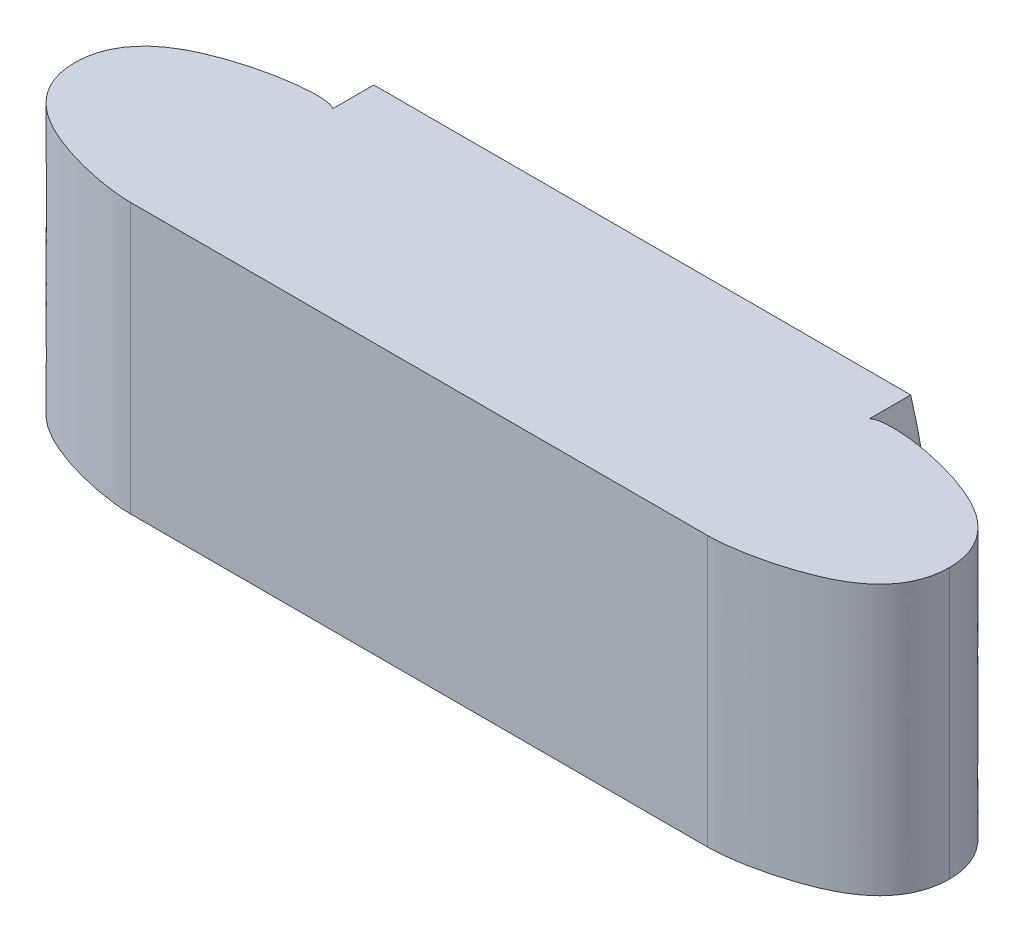
ISO-10303-21;
HEADER;
FILE_DESCRIPTION(('STEP AP214'),'2;1');
FILE_NAME('part.step','',(''),(''),'','','');
FILE_SCHEMA(('AUTOMOTIVE_DESIGN { 1 0 10303 214 1 1 1 1 }'));
ENDSEC;
DATA;
#1=APPLICATION_CONTEXT('core data for automotive mechanical design processes');
#2=APPLICATION_PROTOCOL_DEFINITION('international standard','automotive_design',2000,#1);
#3=PRODUCT_CONTEXT('',#1,'mechanical');
#4=PRODUCT('Part','Part','',(#3));
#5=PRODUCT_RELATED_PRODUCT_CATEGORY('part','',(#4));
#6=PRODUCT_DEFINITION_FORMATION('','',#4);
#7=PRODUCT_DEFINITION_CONTEXT('part definition',#1,'design');
#8=PRODUCT_DEFINITION('design','',#6,#7);
#9=PRODUCT_DEFINITION_SHAPE('','',#8);
#10=(LENGTH_UNIT() NAMED_UNIT(*) SI_UNIT(.MILLI.,.METRE.));
#11=(NAMED_UNIT(*) PLANE_ANGLE_UNIT() SI_UNIT($,.RADIAN.));
#12=(NAMED_UNIT(*) SI_UNIT($,.STERADIAN.) SOLID_ANGLE_UNIT());
#13=UNCERTAINTY_MEASURE_WITH_UNIT(LENGTH_MEASURE(1.E-05),#10,'distance_accuracy_value','');
#14=(GEOMETRIC_REPRESENTATION_CONTEXT(3) GLOBAL_UNCERTAINTY_ASSIGNED_CONTEXT((#13)) GLOBAL_UNIT_ASSIGNED_CONTEXT((#10,
#11,#12)) REPRESENTATION_CONTEXT('',''));
#15=CARTESIAN_POINT('',(0.,0.,0.));
#16=DIRECTION('',(0.,0.,1.));
#17=DIRECTION('',(1.,0.,0.));
#18=AXIS2_PLACEMENT_3D('',#15,#16,#17);
#19=CARTESIAN_POINT('',(0.,0.,1.));
#20=DIRECTION('',(0.,0.,-1.));
#21=DIRECTION('',(0.,-1.,0.));
#22=AXIS2_PLACEMENT_3D('',#19,#20,#21);
#23=PLANE('',#22);
#24=CARTESIAN_POINT('',(0.,0.,1.));
#25=DIRECTION('',(0.,0.,-1.));
#26=DIRECTION('',(0.,1.,0.));
#27=AXIS2_PLACEMENT_3D('',#24,#25,#26);
#28=CIRCLE('',#27,7.);
#29=CARTESIAN_POINT('',(0.,7.,1.));
#30=VERTEX_POINT('',#29);
#31=CARTESIAN_POINT('',(0.,-7.,1.));
#32=VERTEX_POINT('',#31);
#33=EDGE_CURVE('E11',#30,#32,#28,.T.);
#34=ORIENTED_EDGE('',*,*,#33,.T.);
#35=CARTESIAN_POINT('',(0.,0.,1.));
#36=DIRECTION('',(0.,0.,-1.));
#37=DIRECTION('',(0.,-1.,0.));
#38=AXIS2_PLACEMENT_3D('',#35,#36,#37);
#39=CIRCLE('',#38,7.);
#40=EDGE_CURVE('E209',#32,#30,#39,.T.);
#41=ORIENTED_EDGE('',*,*,#40,.T.);
#42=EDGE_LOOP('',(#34,#41));
#43=FACE_BOUND('',#42,.T.);
#44=ADVANCED_FACE('F17',(#43),#23,.T.);
#45=CARTESIAN_POINT('',(0.,0.,0.));
#46=DIRECTION('',(0.,0.,-1.));
#47=DIRECTION('',(0.,-1.,0.));
#48=AXIS2_PLACEMENT_3D('',#45,#46,#47);
#49=CYLINDRICAL_SURFACE('',#48,7.);
#50=DIRECTION('',(0.,0.,1.));
#51=VECTOR('',#50,1.);
#52=CARTESIAN_POINT('',(0.,-7.,0.));
#53=LINE('',#52,#51);
#54=CARTESIAN_POINT('',(0.,-7.,0.));
#55=VERTEX_POINT('',#54);
#56=EDGE_CURVE('E29',#55,#32,#53,.T.);
#57=ORIENTED_EDGE('',*,*,#56,.T.);
#58=ORIENTED_EDGE('',*,*,#33,.F.);
#59=DIRECTION('',(0.,0.,1.));
#60=VECTOR('',#59,1.);
#61=CARTESIAN_POINT('',(0.,7.,0.));
#62=LINE('',#61,#60);
#63=CARTESIAN_POINT('',(0.,7.,0.));
#64=VERTEX_POINT('',#63);
#65=EDGE_CURVE('E202',#64,#30,#62,.T.);
#66=ORIENTED_EDGE('',*,*,#65,.F.);
#67=CARTESIAN_POINT('',(0.,0.,0.));
#68=DIRECTION('',(0.,0.,-1.));
#69=DIRECTION('',(0.,1.,0.));
#70=AXIS2_PLACEMENT_3D('',#67,#68,#69);
#71=CIRCLE('',#70,7.);
#72=EDGE_CURVE('E225',#64,#55,#71,.T.);
#73=ORIENTED_EDGE('',*,*,#72,.T.);
#74=EDGE_LOOP('',(#57,#58,#66,#73));
#75=FACE_BOUND('',#74,.T.);
#76=ADVANCED_FACE('F316',(#75),#49,.F.);
#77=CARTESIAN_POINT('',(0.,0.,0.));
#78=DIRECTION('',(0.,0.,-1.));
#79=DIRECTION('',(0.,-1.,0.));
#80=AXIS2_PLACEMENT_3D('',#77,#78,#79);
#81=CYLINDRICAL_SURFACE('',#80,7.);
#82=ORIENTED_EDGE('',*,*,#65,.T.);
#83=ORIENTED_EDGE('',*,*,#40,.F.);
#84=ORIENTED_EDGE('',*,*,#56,.F.);
#85=CARTESIAN_POINT('',(0.,0.,0.));
#86=DIRECTION('',(0.,0.,-1.));
#87=DIRECTION('',(0.,-1.,0.));
#88=AXIS2_PLACEMENT_3D('',#85,#86,#87);
#89=CIRCLE('',#88,7.);
#90=EDGE_CURVE('E210',#55,#64,#89,.T.);
#91=ORIENTED_EDGE('',*,*,#90,.T.);
#92=EDGE_LOOP('',(#82,#83,#84,#91));
#93=FACE_BOUND('',#92,.T.);
#94=ADVANCED_FACE('F523',(#93),#81,.F.);
#95=CARTESIAN_POINT('',(47.,-14.5,0.));
#96=DIRECTION('',(0.,0.,-1.));
#97=DIRECTION('',(0.,-1.,0.));
#98=AXIS2_PLACEMENT_3D('',#95,#96,#97);
#99=PLANE('',#98);
#100=ORIENTED_EDGE('',*,*,#72,.F.);
#101=ORIENTED_EDGE('',*,*,#90,.F.);
#102=EDGE_LOOP('',(#100,#101));
#103=FACE_BOUND('',#102,.T.);
#104=DIRECTION('',(-1.,0.,0.));
#105=VECTOR('',#104,1.);
#106=CARTESIAN_POINT('',(28.85133226985,-14.5,0.));
#107=LINE('',#106,#105);
#108=CARTESIAN_POINT('',(28.85133226985,-14.5,0.));
#109=VERTEX_POINT('',#108);
#110=CARTESIAN_POINT('',(-28.85133226985,-14.5,0.));
#111=VERTEX_POINT('',#110);
#112=EDGE_CURVE('E139',#109,#111,#107,.T.);
#113=ORIENTED_EDGE('',*,*,#112,.T.);
#114=CARTESIAN_POINT('',(19.,0.,0.));
#115=DIRECTION('',(0.,0.,1.));
#116=DIRECTION('',(-0.957026645397087,0.289999999999996,0.));
#117=AXIS2_PLACEMENT_3D('',#114,#115,#116);
#118=CIRCLE('',#117,50.);
#119=CARTESIAN_POINT('',(-28.85133226985,14.5,0.));
#120=VERTEX_POINT('',#119);
#121=EDGE_CURVE('E219',#120,#111,#118,.T.);
#122=ORIENTED_EDGE('',*,*,#121,.F.);
#123=DIRECTION('',(-1.,0.,0.));
#124=VECTOR('',#123,1.);
#125=CARTESIAN_POINT('',(28.85133226985,14.5,0.));
#126=LINE('',#125,#124);
#127=CARTESIAN_POINT('',(28.85133226985,14.5,0.));
#128=VERTEX_POINT('',#127);
#129=EDGE_CURVE('E170',#128,#120,#126,.T.);
#130=ORIENTED_EDGE('',*,*,#129,.F.);
#131=CARTESIAN_POINT('',(-19.,0.,0.));
#132=DIRECTION('',(0.,0.,1.));
#133=DIRECTION('',(0.957026645397087,-0.289999999999996,0.));
#134=AXIS2_PLACEMENT_3D('',#131,#132,#133);
#135=CIRCLE('',#134,50.);
#136=EDGE_CURVE('E122',#109,#128,#135,.T.);
#137=ORIENTED_EDGE('',*,*,#136,.F.);
#138=EDGE_LOOP('',(#113,#122,#130,#137));
#139=FACE_BOUND('',#138,.T.);
#140=ADVANCED_FACE('F183',(#103,#139),#99,.T.);
#141=CARTESIAN_POINT('',(19.,0.,0.));
#142=DIRECTION('',(0.,0.,-1.));
#143=DIRECTION('',(0.,1.,0.));
#144=AXIS2_PLACEMENT_3D('',#141,#142,#143);
#145=CYLINDRICAL_SURFACE('',#144,50.);
#146=CARTESIAN_POINT('',(-28.8513322698526,14.5,4.42269033307216));
#147=CARTESIAN_POINT('',(-28.8685334892836,14.4432512843717,4.40855417445422));
#148=CARTESIAN_POINT('',(-28.8857298203386,14.3862390733473,4.39554570410287));
#149=CARTESIAN_POINT('',(-28.9216691597664,14.2663869319458,4.37019524061437));
#150=CARTESIAN_POINT('',(-28.9404044254138,14.2035063921404,4.35803301452686));
#151=CARTESIAN_POINT('',(-29.0012036666233,13.997897076426,4.32096496816654));
#152=CARTESIAN_POINT('',(-29.0428910514439,13.8544764082208,4.29933095131266));
#153=CARTESIAN_POINT('',(-29.1313728730695,13.5444032256657,4.25803922184989));
#154=CARTESIAN_POINT('',(-29.1779599739763,13.3775883700076,4.2392046909218));
#155=CARTESIAN_POINT('',(-29.2755674982137,13.0206511278056,4.20356238901548));
#156=CARTESIAN_POINT('',(-29.3263447867834,12.8304026723969,4.18736499573087));
#157=CARTESIAN_POINT('',(-29.4031434971355,12.5359757693923,4.16520367698253));
#158=CARTESIAN_POINT('',(-29.4299019662709,12.4320813197536,4.15793988033473));
#159=CARTESIAN_POINT('',(-29.4806784406313,12.2324722234143,4.14488466623565));
#160=CARTESIAN_POINT('',(-29.5047433132718,12.1367742074615,4.13902172867298));
#161=CARTESIAN_POINT('',(-29.5785565364245,11.8395948336228,4.12187188897468));
#162=CARTESIAN_POINT('',(-29.6273686443393,11.6378137736929,4.11173185226608));
#163=CARTESIAN_POINT('',(-29.725521164531,11.2204661696364,4.09308931718464));
#164=CARTESIAN_POINT('',(-29.7746910820035,11.0048531116903,4.08473539001696));
#165=CARTESIAN_POINT('',(-29.8730003705732,10.5598373327813,4.06948485625474));
#166=CARTESIAN_POINT('',(-29.9219575274125,10.3303903416587,4.06270715675907));
#167=CARTESIAN_POINT('',(-30.0193322047079,9.85770521739186,4.05043359882377));
#168=CARTESIAN_POINT('',(-30.0675602817692,9.61442569989027,4.04503269926015));
#169=CARTESIAN_POINT('',(-30.1673658022485,9.09127274352385,4.03490636143544));
#170=CARTESIAN_POINT('',(-30.2183896063582,8.81128940783681,4.03039772506137));
#171=CARTESIAN_POINT('',(-30.317289525825,8.24089466126707,4.02259963448827));
#172=CARTESIAN_POINT('',(-30.3649986528288,7.95045364094603,4.01935707105615));
#173=CARTESIAN_POINT('',(-30.456683381632,7.35914320806552,4.01384171701913));
#174=CARTESIAN_POINT('',(-30.5004835589762,7.05824628303726,4.01160450527875));
#175=CARTESIAN_POINT('',(-30.5838531120493,6.44602050510631,4.0078789302097));
#176=CARTESIAN_POINT('',(-30.6232415667313,6.13466680950786,4.00641690764801));
#177=CARTESIAN_POINT('',(-30.6783965631997,5.66347646332562,4.00465655834079));
#178=CARTESIAN_POINT('',(-30.6963063893175,5.50388849662287,4.00413859254919));
#179=CARTESIAN_POINT('',(-30.7336623654825,5.15648943274983,4.00315074159767));
#180=CARTESIAN_POINT('',(-30.7528252551032,4.96864789071186,4.00270530893085));
#181=CARTESIAN_POINT('',(-30.8071955585984,4.40452939345022,4.00157486199885));
#182=CARTESIAN_POINT('',(-30.8392512755186,4.02793873958225,4.00109667283236));
#183=CARTESIAN_POINT('',(-30.8750907614369,3.53786467822021,4.00067601411334));
#184=CARTESIAN_POINT('',(-30.8829617979773,3.42466872491621,4.00059281966735));
#185=CARTESIAN_POINT('',(-30.9107901824509,3.00389087760832,4.00032523277148));
#186=CARTESIAN_POINT('',(-30.9283041489891,2.69614383247203,4.00021223761968));
#187=CARTESIAN_POINT('',(-30.9640688891592,1.94730004448418,4.00003559898279));
#188=CARTESIAN_POINT('',(-30.9793661351159,1.5060596261032,4.00001439673422));
#189=CARTESIAN_POINT('',(-30.9981674629886,0.621723945996496,3.99999636293797));
#190=CARTESIAN_POINT('',(-31.00162847596,0.178627771972686,3.99999962025518));
#191=CARTESIAN_POINT('',(-30.9972035166171,-0.657834905050057,4.00000037829351));
#192=CARTESIAN_POINT('',(-30.9905459207424,-1.05120857713004,3.99999848333535));
#193=CARTESIAN_POINT('',(-30.9681351243441,-1.83275380614037,4.00003797283279));
#194=CARTESIAN_POINT('',(-30.9524972328387,-2.22092863644744,4.00007881391404));
#195=CARTESIAN_POINT('',(-30.912296731366,-2.99206799865676,4.00031482781505));
#196=CARTESIAN_POINT('',(-30.8878452974804,-3.37503833537559,4.00050811226007));
#197=CARTESIAN_POINT('',(-30.8303764580725,-4.13576889441879,4.00122472676346));
#198=CARTESIAN_POINT('',(-30.7974641120535,-4.51353702848767,4.00174411427821));
#199=CARTESIAN_POINT('',(-30.741881690069,-5.07790324891179,4.00295727100322));
#200=CARTESIAN_POINT('',(-30.7224180975414,-5.26482304090734,4.00343096580955));
#201=CARTESIAN_POINT('',(-30.6848977684737,-5.60691935801618,4.00446678224037));
#202=CARTESIAN_POINT('',(-30.6671577151499,-5.76213073436077,4.00500050062682));
#203=CARTESIAN_POINT('',(-30.61260294046,-6.22056339112905,4.00680438692722));
#204=CARTESIAN_POINT('',(-30.573754551061,-6.52354471894471,4.00829103718084));
#205=CARTESIAN_POINT('',(-30.4917194242113,-7.11953576041407,4.01204394555113));
#206=CARTESIAN_POINT('',(-30.4487003574996,-7.4125687555967,4.01428514490087));
#207=CARTESIAN_POINT('',(-30.3588038092634,-7.98866197621047,4.01977148105198));
#208=CARTESIAN_POINT('',(-30.3120887821078,-8.27174785362326,4.02298307918675));
#209=CARTESIAN_POINT('',(-30.2153642692413,-8.82794328786762,4.03066431287014));
#210=CARTESIAN_POINT('',(-30.1655094559711,-9.10108036451069,4.03509007371257));
#211=CARTESIAN_POINT('',(-30.0670205854302,-9.61713423094414,4.04509164863001));
#212=CARTESIAN_POINT('',(-30.0188326548399,-9.86013958808904,4.05049241622623));
#213=CARTESIAN_POINT('',(-29.9215446151803,-10.3322949705934,4.06276316894499));
#214=CARTESIAN_POINT('',(-29.8726334365858,-10.5614862853619,4.06953835082929));
#215=CARTESIAN_POINT('',(-29.7744210680594,-11.0060094756957,4.08478053158945));
#216=CARTESIAN_POINT('',(-29.7253015972809,-11.2213855108374,4.09312884650478));
#217=CARTESIAN_POINT('',(-29.6272527061696,-11.6382778001472,4.11175592876552));
#218=CARTESIAN_POINT('',(-29.5784933561758,-11.8398404581162,4.12188643923323));
#219=CARTESIAN_POINT('',(-29.5047609796736,-12.1366997780758,4.13901768511418));
#220=CARTESIAN_POINT('',(-29.4807224711625,-12.2322955658358,4.14487397614259));
#221=CARTESIAN_POINT('',(-29.4299701741199,-12.4318166510738,4.15792166051878));
#222=CARTESIAN_POINT('',(-29.4032088735188,-12.5357250924123,4.16518552280392));
#223=CARTESIAN_POINT('',(-29.3264018936421,-12.8301913039029,4.18734719030021));
#224=CARTESIAN_POINT('',(-29.2756189044651,-13.0204650140331,4.20354501639446));
#225=CARTESIAN_POINT('',(-29.1779999470289,-13.3774490513569,4.23918885930767));
#226=CARTESIAN_POINT('',(-29.1314072173212,-13.544285479515,4.25802439468686));
#227=CARTESIAN_POINT('',(-29.0429144954109,-13.8543981065911,4.29931895586374));
#228=CARTESIAN_POINT('',(-29.0012219191914,-13.9978366822976,4.32095464174467));
#229=CARTESIAN_POINT('',(-28.940415089945,-14.2034713541018,4.35802616088258));
#230=CARTESIAN_POINT('',(-28.9216775267362,-14.2663594640326,4.3701895642232));
#231=CARTESIAN_POINT('',(-28.8857338584984,-14.3862258170942,4.39554265630936));
#232=CARTESIAN_POINT('',(-28.8685354956447,-14.4432446779475,4.40855253579496));
#233=CARTESIAN_POINT('',(-28.8513322698526,-14.5,4.42269033307216));
#234=B_SPLINE_CURVE_WITH_KNOTS('',3,(#146,#147,#148,#149,#150,#151,#152,#153,#154,#155,#156,
#157,#158,#159,#160,#161,#162,#163,#164,#165,#166,#167,#168,#169,#170,#171,#172,#173,#174,#175,
#176,#177,#178,#179,#180,#181,#182,#183,#184,#185,#186,#187,#188,#189,#190,#191,#192,#193,#194,
#195,#196,#197,#198,#199,#200,#201,#202,#203,#204,#205,#206,#207,#208,#209,#210,#211,#212,#213,
#214,#215,#216,#217,#218,#219,#220,#221,#222,#223,#224,#225,#226,#227,#228,#229,#230,#231,#232,
#233),.UNSPECIFIED.,.F.,.F.,(4,2,2,2,2,2,2,2,2,2,2,2,2,2,2,2,2,2,2,2,2,2,2,2,2,2,2,2,2,2,2,2,2,
2,2,2,2,2,2,2,2,2,2,4),(0.,0.182843228150947,0.3830011565302,0.835581278887001,1.35815989354449,
1.95080828171586,2.27339608046583,2.56994618904999,3.19345658896128,3.8573451742631,
4.56144251521076,5.30562993673431,6.15947607017043,7.04247971972194,7.9546562088416,
8.89611099540449,9.37787655306657,9.94431944569695,11.0780515123653,11.4184583771191,
12.3431401470449,13.6674964771679,14.9966666942951,16.176853037296,17.3422139510085,
18.4933615973835,19.6308531398629,20.1946362383189,20.6632990758169,21.5796383140351,
22.4681368651641,23.3288877390836,24.1619012895102,24.9052586707058,25.6085773381916,
26.2717389802642,26.894574843882,27.1908076261088,27.5134381059666,28.1061639347782,
28.628809339952,29.081445497808,29.2816273966252,29.4644919020293),.UNSPECIFIED.);
#235=CARTESIAN_POINT('',(-28.85133226985,-14.5,4.422690333069));
#236=VERTEX_POINT('',#235);
#237=CARTESIAN_POINT('',(-28.85133226985,14.5,4.422690333069));
#238=VERTEX_POINT('',#237);
#239=EDGE_CURVE('E226',#236,#238,#234,.F.);
#240=ORIENTED_EDGE('',*,*,#239,.T.);
#241=DIRECTION('',(0.,0.,-1.));
#242=VECTOR('',#241,1.);
#243=CARTESIAN_POINT('',(-28.85133226985,14.5,4.422690333069));
#244=LINE('',#243,#242);
#245=EDGE_CURVE('E282',#238,#120,#244,.T.);
#246=ORIENTED_EDGE('',*,*,#245,.T.);
#247=ORIENTED_EDGE('',*,*,#121,.T.);
#248=DIRECTION('',(0.,0.,-1.));
#249=VECTOR('',#248,1.);
#250=CARTESIAN_POINT('',(-28.85133226985,-14.5,4.422690333069));
#251=LINE('',#250,#249);
#252=EDGE_CURVE('E147',#236,#111,#251,.T.);
#253=ORIENTED_EDGE('',*,*,#252,.F.);
#254=EDGE_LOOP('',(#240,#246,#247,#253));
#255=FACE_BOUND('',#254,.T.);
#256=ADVANCED_FACE('F297',(#255),#145,.T.);
#257=CARTESIAN_POINT('',(-46.99635920013,-17.4,14.24913241907));
#258=CARTESIAN_POINT('',(-46.99879390348,-17.4,14.16541556951));
#259=CARTESIAN_POINT('',(-47.02748718326,-17.4,12.18980767287));
#260=CARTESIAN_POINT('',(-45.51419571602,-17.4,8.495823372431));
#261=CARTESIAN_POINT('',(-39.31887974557,-17.4,5.12263144327));
#262=CARTESIAN_POINT('',(-31.51819213462,-17.4,3.68258193458));
#263=CARTESIAN_POINT('',(-29.07947994879,-17.4,4.157639473443));
#264=CARTESIAN_POINT('',(-28.77650916067,-17.4,4.493852182639));
#265=(BOUNDED_CURVE() B_SPLINE_CURVE(3,(#257,#258,#259,#260,#261,#262,#263,#264),.UNSPECIFIED.,
.F.,.F.) B_SPLINE_CURVE_WITH_KNOTS((4,1,1,1,1,4),(0.,0.008553627505914,0.2034925259936,
0.4709151678218,0.8244325212668,1.),
.UNSPECIFIED.) CURVE() GEOMETRIC_REPRESENTATION_ITEM() RATIONAL_B_SPLINE_CURVE((1.,1.,1.,1.,1.,
1.,1.,1.)) REPRESENTATION_ITEM(''));
#266=DIRECTION('',(0.,-1.,0.));
#267=VECTOR('',#266,1.);
#268=SURFACE_OF_LINEAR_EXTRUSION('',#265,#267);
#269=CARTESIAN_POINT('',(-47.,-14.5,14.));
#270=CARTESIAN_POINT('',(-47.,-14.5,12.12271073508));
#271=CARTESIAN_POINT('',(-45.51419571602,-14.5,8.495823372431));
#272=CARTESIAN_POINT('',(-39.31887974557,-14.5,5.12263144327));
#273=CARTESIAN_POINT('',(-31.64440968941,-14.5,3.705882384083));
#274=CARTESIAN_POINT('',(-29.19991442451,-14.5,4.135345483751));
#275=CARTESIAN_POINT('',(-28.85133226985,-14.5,4.422690333069));
#276=(BOUNDED_CURVE() B_SPLINE_CURVE(3,(#269,#270,#271,#272,#273,#274,#275),.UNSPECIFIED.,.F.,
.F.) B_SPLINE_CURVE_WITH_KNOTS((4,1,1,1,4),(0.,0.1992102382115,0.4724924235274,0.8337557564898,
1.),.UNSPECIFIED.) CURVE() GEOMETRIC_REPRESENTATION_ITEM() RATIONAL_B_SPLINE_CURVE((1.,1.,1.,1.,
1.,1.,1.)) REPRESENTATION_ITEM(''));
#277=CARTESIAN_POINT('',(-47.,-14.5,14.));
#278=VERTEX_POINT('',#277);
#279=EDGE_CURVE('E217',#278,#236,#276,.T.);
#280=ORIENTED_EDGE('',*,*,#279,.F.);
#281=DIRECTION('',(2.88159969449197E-09,0.999999999999989,1.51970758490798E-07));
#282=VECTOR('',#281,1.);
#283=CARTESIAN_POINT('',(-47.,-14.5,14.));
#284=LINE('',#283,#282);
#285=CARTESIAN_POINT('',(-46.99999991643,14.5,14.00000440715));
#286=VERTEX_POINT('',#285);
#287=EDGE_CURVE('E249',#278,#286,#284,.T.);
#288=ORIENTED_EDGE('',*,*,#287,.T.);
#289=CARTESIAN_POINT('',(-28.85133226985,14.5,4.422690333069));
#290=CARTESIAN_POINT('',(-29.19991442451,14.5,4.135345483751));
#291=CARTESIAN_POINT('',(-31.64440969258,14.5,3.705882217003));
#292=CARTESIAN_POINT('',(-39.31887972302,14.5,5.122632632182));
#293=CARTESIAN_POINT('',(-45.51419576954,14.5,8.495820549715));
#294=CARTESIAN_POINT('',(-46.99999991643,14.5,12.12271514223));
#295=CARTESIAN_POINT('',(-46.99999991643,14.5,14.00000440715));
#296=(BOUNDED_CURVE() B_SPLINE_CURVE(3,(#289,#290,#291,#292,#293,#294,#295),.UNSPECIFIED.,.F.,
.F.) B_SPLINE_CURVE_WITH_KNOTS((4,1,1,1,4),(0.,0.1662442435102,0.5275075764726,0.8007897617885,
1.),.UNSPECIFIED.) CURVE() GEOMETRIC_REPRESENTATION_ITEM() RATIONAL_B_SPLINE_CURVE((1.,1.,1.,1.,
1.,1.,1.)) REPRESENTATION_ITEM(''));
#297=EDGE_CURVE('E259',#238,#286,#296,.T.);
#298=ORIENTED_EDGE('',*,*,#297,.F.);
#299=ORIENTED_EDGE('',*,*,#239,.F.);
#300=EDGE_LOOP('',(#280,#288,#298,#299));
#301=FACE_BOUND('',#300,.T.);
#302=ADVANCED_FACE('F306',(#301),#268,.T.);
#303=CARTESIAN_POINT('',(-46.99747170424,-17.4,13.79256405441));
#304=CARTESIAN_POINT('',(-46.99916158362,-17.4,13.86217672162));
#305=CARTESIAN_POINT('',(-47.02291759727,-17.4,15.8213468068));
#306=CARTESIAN_POINT('',(-45.51419571602,-17.4,19.50417662757));
#307=CARTESIAN_POINT('',(-39.31887974557,-17.4,22.87736855673));
#308=CARTESIAN_POINT('',(-33.13239782951,-17.4,24.0194268839));
#309=CARTESIAN_POINT('',(-30.86510483078,-17.4,23.9994095162));
#310=CARTESIAN_POINT('',(-30.79940109384,-17.4,23.99822374949));
#311=(BOUNDED_CURVE() B_SPLINE_CURVE(3,(#303,#304,#305,#306,#307,#308,#309,#310),.UNSPECIFIED.,
.F.,.F.) B_SPLINE_CURVE_WITH_KNOTS((4,1,1,1,1,4),(0.,0.008553627505914,0.2423617865144,
0.5631063687817,0.9871122610268,1.),
.UNSPECIFIED.) CURVE() GEOMETRIC_REPRESENTATION_ITEM() RATIONAL_B_SPLINE_CURVE((1.,1.,1.,1.,1.,
1.,1.,1.)) REPRESENTATION_ITEM(''));
#312=DIRECTION('',(0.,1.,0.));
#313=VECTOR('',#312,1.);
#314=SURFACE_OF_LINEAR_EXTRUSION('',#311,#313);
#315=CARTESIAN_POINT('',(-47.,-14.5,14.));
#316=CARTESIAN_POINT('',(-47.,-14.5,15.87728926492));
#317=CARTESIAN_POINT('',(-45.51419571602,-14.5,19.50417662757));
#318=CARTESIAN_POINT('',(-39.31887974557,-14.5,22.87736855673));
#319=CARTESIAN_POINT('',(-33.23763244238,-14.5,24.));
#320=CARTESIAN_POINT('',(-31.,-14.5,24.));
#321=(BOUNDED_CURVE() B_SPLINE_CURVE(3,(#315,#316,#317,#318,#319,#320),.UNSPECIFIED.,.F.,
.F.) B_SPLINE_CURVE_WITH_KNOTS((4,1,1,4),(0.,0.2389311697831,0.5667036417435,1.),
.UNSPECIFIED.) CURVE() GEOMETRIC_REPRESENTATION_ITEM() RATIONAL_B_SPLINE_CURVE((1.,1.,1.,1.,1.,1.)) REPRESENTATION_ITEM(''));
#322=CARTESIAN_POINT('',(-31.,-14.5,24.));
#323=VERTEX_POINT('',#322);
#324=EDGE_CURVE('E211',#278,#323,#321,.T.);
#325=ORIENTED_EDGE('',*,*,#324,.T.);
#326=DIRECTION('',(0.,1.,0.));
#327=VECTOR('',#326,1.);
#328=CARTESIAN_POINT('',(-31.,-14.5,24.));
#329=LINE('',#328,#327);
#330=CARTESIAN_POINT('',(-31.,14.5,24.));
#331=VERTEX_POINT('',#330);
#332=EDGE_CURVE('E253',#323,#331,#329,.T.);
#333=ORIENTED_EDGE('',*,*,#332,.T.);
#334=CARTESIAN_POINT('',(-46.99999991643,14.5,14.00000440715));
#335=CARTESIAN_POINT('',(-46.99999991643,14.5,15.87729367207));
#336=CARTESIAN_POINT('',(-45.51419576968,14.5,19.50417379763));
#337=CARTESIAN_POINT('',(-39.31887972225,14.5,22.87736978616));
#338=CARTESIAN_POINT('',(-33.23763244238,14.5,24.));
#339=CARTESIAN_POINT('',(-31.,14.5,24.));
#340=(BOUNDED_CURVE() B_SPLINE_CURVE(3,(#334,#335,#336,#337,#338,#339),.UNSPECIFIED.,.F.,
.F.) B_SPLINE_CURVE_WITH_KNOTS((4,1,1,4),(0.,0.2389311697831,0.5667036417435,1.),
.UNSPECIFIED.) CURVE() GEOMETRIC_REPRESENTATION_ITEM() RATIONAL_B_SPLINE_CURVE((1.,1.,1.,1.,1.,1.)) REPRESENTATION_ITEM(''));
#341=EDGE_CURVE('E254',#286,#331,#340,.T.);
#342=ORIENTED_EDGE('',*,*,#341,.F.);
#343=ORIENTED_EDGE('',*,*,#287,.F.);
#344=EDGE_LOOP('',(#325,#333,#342,#343));
#345=FACE_BOUND('',#344,.T.);
#346=ADVANCED_FACE('F310',(#345),#314,.T.);
#347=CARTESIAN_POINT('',(-47.,-14.5,24.));
#348=DIRECTION('',(0.,0.,1.));
#349=DIRECTION('',(1.,0.,0.));
#350=AXIS2_PLACEMENT_3D('',#347,#348,#349);
#351=PLANE('',#350);
#352=DIRECTION('',(1.,0.,0.));
#353=VECTOR('',#352,1.);
#354=CARTESIAN_POINT('',(-31.,14.5,24.));
#355=LINE('',#354,#353);
#356=CARTESIAN_POINT('',(31.,14.5,24.));
#357=VERTEX_POINT('',#356);
#358=EDGE_CURVE('E242',#331,#357,#355,.T.);
#359=ORIENTED_EDGE('',*,*,#358,.F.);
#360=ORIENTED_EDGE('',*,*,#332,.F.);
#361=DIRECTION('',(1.,0.,0.));
#362=VECTOR('',#361,1.);
#363=CARTESIAN_POINT('',(-31.,-14.5,24.));
#364=LINE('',#363,#362);
#365=CARTESIAN_POINT('',(31.,-14.5,24.));
#366=VERTEX_POINT('',#365);
#367=EDGE_CURVE('E218',#323,#366,#364,.T.);
#368=ORIENTED_EDGE('',*,*,#367,.T.);
#369=DIRECTION('',(0.,1.,0.));
#370=VECTOR('',#369,1.);
#371=CARTESIAN_POINT('',(31.,-14.5,24.));
#372=LINE('',#371,#370);
#373=EDGE_CURVE('E241',#366,#357,#372,.T.);
#374=ORIENTED_EDGE('',*,*,#373,.T.);
#375=EDGE_LOOP('',(#359,#360,#368,#374));
#376=FACE_BOUND('',#375,.T.);
#377=ADVANCED_FACE('F307',(#376),#351,.T.);
#378=CARTESIAN_POINT('',(46.99747170424,-17.4,13.79256405441));
#379=CARTESIAN_POINT('',(46.99916158362,-17.4,13.86217672162));
#380=CARTESIAN_POINT('',(47.02291759727,-17.4,15.8213468068));
#381=CARTESIAN_POINT('',(45.51419571602,-17.4,19.50417662757));
#382=CARTESIAN_POINT('',(39.31887974557,-17.4,22.87736855673));
#383=CARTESIAN_POINT('',(33.13239782951,-17.4,24.0194268839));
#384=CARTESIAN_POINT('',(30.86510483078,-17.4,23.9994095162));
#385=CARTESIAN_POINT('',(30.79940109384,-17.4,23.99822374949));
#386=(BOUNDED_CURVE() B_SPLINE_CURVE(3,(#378,#379,#380,#381,#382,#383,#384,#385),.UNSPECIFIED.,
.F.,.F.) B_SPLINE_CURVE_WITH_KNOTS((4,1,1,1,1,4),(0.,0.008553627505914,0.2423617865144,
0.5631063687817,0.9871122610268,1.),
.UNSPECIFIED.) CURVE() GEOMETRIC_REPRESENTATION_ITEM() RATIONAL_B_SPLINE_CURVE((1.,1.,1.,1.,1.,
1.,1.,1.)) REPRESENTATION_ITEM(''));
#387=DIRECTION('',(0.,-1.,0.));
#388=VECTOR('',#387,1.);
#389=SURFACE_OF_LINEAR_EXTRUSION('',#386,#388);
#390=CARTESIAN_POINT('',(47.,14.5,14.));
#391=CARTESIAN_POINT('',(47.,14.5,15.87728926492));
#392=CARTESIAN_POINT('',(45.51419571602,14.5,19.50417662757));
#393=CARTESIAN_POINT('',(39.31887974557,14.5,22.87736855673));
#394=CARTESIAN_POINT('',(33.23763244238,14.5,24.));
#395=CARTESIAN_POINT('',(31.,14.5,24.));
#396=(BOUNDED_CURVE() B_SPLINE_CURVE(3,(#390,#391,#392,#393,#394,#395),.UNSPECIFIED.,.F.,
.F.) B_SPLINE_CURVE_WITH_KNOTS((4,1,1,4),(0.,0.2389311697831,0.5667036417435,1.),
.UNSPECIFIED.) CURVE() GEOMETRIC_REPRESENTATION_ITEM() RATIONAL_B_SPLINE_CURVE((1.,1.,1.,1.,1.,1.)) REPRESENTATION_ITEM(''));
#397=CARTESIAN_POINT('',(47.,14.5,14.));
#398=VERTEX_POINT('',#397);
#399=EDGE_CURVE('E232',#398,#357,#396,.T.);
#400=ORIENTED_EDGE('',*,*,#399,.T.);
#401=ORIENTED_EDGE('',*,*,#373,.F.);
#402=CARTESIAN_POINT('',(46.99999998133,-14.5,14.00000098442));
#403=CARTESIAN_POINT('',(46.99999998133,-14.5,15.87729024934));
#404=CARTESIAN_POINT('',(45.514195728,-14.5,19.50417599545));
#405=CARTESIAN_POINT('',(39.31887974036,-14.5,22.87736883135));
#406=CARTESIAN_POINT('',(33.23763244238,-14.5,24.));
#407=CARTESIAN_POINT('',(31.,-14.5,24.));
#408=(BOUNDED_CURVE() B_SPLINE_CURVE(3,(#402,#403,#404,#405,#406,#407),.UNSPECIFIED.,.F.,
.F.) B_SPLINE_CURVE_WITH_KNOTS((4,1,1,4),(0.,0.2389311697831,0.5667036417435,1.),
.UNSPECIFIED.) CURVE() GEOMETRIC_REPRESENTATION_ITEM() RATIONAL_B_SPLINE_CURVE((1.,1.,1.,1.,1.,1.)) REPRESENTATION_ITEM(''));
#409=CARTESIAN_POINT('',(46.99999998133,-14.5,14.00000098442));
#410=VERTEX_POINT('',#409);
#411=EDGE_CURVE('E227',#410,#366,#408,.T.);
#412=ORIENTED_EDGE('',*,*,#411,.F.);
#413=DIRECTION('',(6.436654734114E-10,1.,-3.394561101176E-08));
#414=VECTOR('',#413,1.);
#415=CARTESIAN_POINT('',(46.99999998133,-14.5,14.00000098442));
#416=LINE('',#415,#414);
#417=EDGE_CURVE('E123',#410,#398,#416,.T.);
#418=ORIENTED_EDGE('',*,*,#417,.T.);
#419=EDGE_LOOP('',(#400,#401,#412,#418));
#420=FACE_BOUND('',#419,.T.);
#421=ADVANCED_FACE('F185',(#420),#389,.T.);
#422=CARTESIAN_POINT('',(0.,14.5,0.));
#423=DIRECTION('',(0.,1.,0.));
#424=DIRECTION('',(1.,0.,0.));
#425=AXIS2_PLACEMENT_3D('',#422,#423,#424);
#426=PLANE('',#425);
#427=DIRECTION('',(0.,0.,1.));
#428=VECTOR('',#427,1.);
#429=CARTESIAN_POINT('',(28.85133226985,14.5,0.));
#430=LINE('',#429,#428);
#431=CARTESIAN_POINT('',(28.85133226985,14.5,4.422690333069));
#432=VERTEX_POINT('',#431);
#433=EDGE_CURVE('E116',#128,#432,#430,.T.);
#434=ORIENTED_EDGE('',*,*,#433,.F.);
#435=ORIENTED_EDGE('',*,*,#129,.T.);
#436=ORIENTED_EDGE('',*,*,#245,.F.);
#437=ORIENTED_EDGE('',*,*,#297,.T.);
#438=ORIENTED_EDGE('',*,*,#341,.T.);
#439=ORIENTED_EDGE('',*,*,#358,.T.);
#440=ORIENTED_EDGE('',*,*,#399,.F.);
#441=CARTESIAN_POINT('',(47.,14.5,14.));
#442=CARTESIAN_POINT('',(47.,14.5,12.12271073508));
#443=CARTESIAN_POINT('',(45.51419571602,14.5,8.495823372431));
#444=CARTESIAN_POINT('',(39.31887974557,14.5,5.12263144327));
#445=CARTESIAN_POINT('',(31.64440968941,14.5,3.705882384083));
#446=CARTESIAN_POINT('',(29.19991442451,14.5,4.135345483751));
#447=CARTESIAN_POINT('',(28.85133226985,14.5,4.422690333069));
#448=(BOUNDED_CURVE() B_SPLINE_CURVE(3,(#441,#442,#443,#444,#445,#446,#447),.UNSPECIFIED.,.F.,
.F.) B_SPLINE_CURVE_WITH_KNOTS((4,1,1,1,4),(0.,0.1992102382115,0.4724924235274,0.8337557564898,
1.),.UNSPECIFIED.) CURVE() GEOMETRIC_REPRESENTATION_ITEM() RATIONAL_B_SPLINE_CURVE((1.,1.,1.,1.,
1.,1.,1.)) REPRESENTATION_ITEM(''));
#449=EDGE_CURVE('E134',#398,#432,#448,.T.);
#450=ORIENTED_EDGE('',*,*,#449,.T.);
#451=EDGE_LOOP('',(#434,#435,#436,#437,#438,#439,#440,#450));
#452=FACE_BOUND('',#451,.T.);
#453=ADVANCED_FACE('F366',(#452),#426,.T.);
#454=CARTESIAN_POINT('',(-19.,0.,0.));
#455=DIRECTION('',(0.,0.,1.));
#456=DIRECTION('',(0.,1.,0.));
#457=AXIS2_PLACEMENT_3D('',#454,#455,#456);
#458=CYLINDRICAL_SURFACE('',#457,50.);
#459=DIRECTION('',(0.,0.,1.));
#460=VECTOR('',#459,1.);
#461=CARTESIAN_POINT('',(28.85133226985,-14.5,0.));
#462=LINE('',#461,#460);
#463=CARTESIAN_POINT('',(28.85133226985,-14.5,4.422690333069));
#464=VERTEX_POINT('',#463);
#465=EDGE_CURVE('E113',#109,#464,#462,.T.);
#466=ORIENTED_EDGE('',*,*,#465,.F.);
#467=ORIENTED_EDGE('',*,*,#136,.T.);
#468=ORIENTED_EDGE('',*,*,#433,.T.);
#469=CARTESIAN_POINT('',(28.8513322698526,-14.5,4.42269033307216));
#470=CARTESIAN_POINT('',(28.8685355369696,-14.4432445360617,4.40855250427363));
#471=CARTESIAN_POINT('',(28.885733918931,-14.3862255229403,4.39554261213665));
#472=CARTESIAN_POINT('',(28.9216776835509,-14.2663585581587,4.37018945538234));
#473=CARTESIAN_POINT('',(28.940415320976,-14.2034699854486,4.35802601177672));
#474=CARTESIAN_POINT('',(29.001222608451,-13.9978330093485,4.32095424034001));
#475=CARTESIAN_POINT('',(29.0429155418384,-13.8543925751714,4.29931841431169));
#476=CARTESIAN_POINT('',(29.1314093521321,-13.5442750010248,4.25802345904045));
#477=CARTESIAN_POINT('',(29.1780028104947,-13.3774354792047,4.23918771319555));
#478=CARTESIAN_POINT('',(29.2756236980322,-13.020444024749,4.20354337991615));
#479=CARTESIAN_POINT('',(29.326407897851,-12.8301659911289,4.18734530448333));
#480=CARTESIAN_POINT('',(29.4032168755303,-12.5356928254539,4.16518329601115));
#481=CARTESIAN_POINT('',(29.429978937333,-12.4317817481239,4.15791931517351));
#482=CARTESIAN_POINT('',(29.4807620695801,-12.2321409042909,4.14486388124769));
#483=CARTESIAN_POINT('',(29.5048300234446,-12.1364277723617,4.13900089665714));
#484=CARTESIAN_POINT('',(29.578652507565,-11.8392015893029,4.12185104470446));
#485=CARTESIAN_POINT('',(29.6274705074967,-11.6373887742439,4.1117111787339));
#486=CARTESIAN_POINT('',(29.7256343197155,-11.2199756382183,4.09306923543117));
#487=CARTESIAN_POINT('',(29.7748095861897,-11.0043287938244,4.08471574196444));
#488=CARTESIAN_POINT('',(29.8731289124156,-10.5592434201063,4.06946625952911));
#489=CARTESIAN_POINT('',(29.92209070347,-10.3297606114408,4.06268918507338));
#490=CARTESIAN_POINT('',(30.0194738445449,-9.85700183042736,4.05041700078315));
#491=CARTESIAN_POINT('',(30.0677056949415,-9.61368446543011,4.04501685328582));
#492=CARTESIAN_POINT('',(30.1675215882276,-9.09043212565003,4.03489181031092));
#493=CARTESIAN_POINT('',(30.2185515254439,-8.81038717294691,4.03038383665458));
#494=CARTESIAN_POINT('',(30.3174616704686,-8.23986734211184,4.02258722407058));
#495=CARTESIAN_POINT('',(30.3651748254925,-7.94936284695229,4.01934547749093));
#496=CARTESIAN_POINT('',(30.4568653497212,-7.35792361430834,4.01383180217034));
#497=CARTESIAN_POINT('',(30.5006672266152,-7.05696135822996,4.01159545095954));
#498=CARTESIAN_POINT('',(30.5840377513198,-6.44460306577514,4.00787155675468));
#499=CARTESIAN_POINT('',(30.6234254081103,-6.13318218232564,4.00641035112313));
#500=CARTESIAN_POINT('',(30.6785773400778,-5.66189032978131,4.00465114060909));
#501=CARTESIAN_POINT('',(30.6964858005754,-5.50226807928821,4.00413354375629));
#502=CARTESIAN_POINT('',(30.7338382732958,-5.15479306903645,4.0031464513805));
#503=CARTESIAN_POINT('',(30.7529988917588,-4.96690985972819,4.00270140251432));
#504=CARTESIAN_POINT('',(30.8073607551714,-4.40266871875228,4.00157203031877));
#505=CARTESIAN_POINT('',(30.8394089682511,-4.02599706751478,4.00109444624613));
#506=CARTESIAN_POINT('',(30.8752361149572,-3.53581837492227,4.00067441906292));
#507=CARTESIAN_POINT('',(30.883104095715,-3.422598743702,4.00059135990719));
#508=CARTESIAN_POINT('',(30.9109179819224,-3.00177169830067,4.0003242616548));
#509=CARTESIAN_POINT('',(30.9284202253321,-2.69399921714642,4.00021153252442));
#510=CARTESIAN_POINT('',(30.9641551596741,-1.94509924294932,4.00003536644285));
#511=CARTESIAN_POINT('',(30.9794340184061,-1.50382818753195,4.00001429272746));
#512=CARTESIAN_POINT('',(30.998196665569,-0.619437941982844,3.9999963740607));
#513=CARTESIAN_POINT('',(31.0016375489951,-0.176317844945929,3.99999961710719));
#514=CARTESIAN_POINT('',(30.9971736592763,0.66011335787185,4.00000038238231));
#515=CARTESIAN_POINT('',(30.9904991828219,1.05343170237053,3.99999850595836));
#516=CARTESIAN_POINT('',(30.9680574983629,1.8348643546545,4.0000381703933));
#517=CARTESIAN_POINT('',(30.9524056198874,2.222981941427,4.0000791658904));
#518=CARTESIAN_POINT('',(30.9121801448437,2.99400489339179,4.00031569651658));
#519=CARTESIAN_POINT('',(30.8877177472937,3.37691606908179,4.00050933975191));
#520=CARTESIAN_POINT('',(30.8302300553546,4.13752638285038,4.00122691452682));
#521=CARTESIAN_POINT('',(30.7973098454327,4.51523343842714,4.00174689839947));
#522=CARTESIAN_POINT('',(30.7417178215612,5.07950732698004,4.00296113544384));
#523=CARTESIAN_POINT('',(30.7222514612622,5.26639586843199,4.0034352173877));
#524=CARTESIAN_POINT('',(30.6847276677042,5.60842595258382,4.00447177049487));
#525=CARTESIAN_POINT('',(30.6669868960411,5.76360235420049,4.00500582175831));
#526=CARTESIAN_POINT('',(30.6124309445565,6.22193163510442,4.0068107237172));
#527=CARTESIAN_POINT('',(30.5735829942676,6.52484460614317,4.00829808737314));
#528=CARTESIAN_POINT('',(30.4915512284629,7.1207010808317,4.01205241716084));
#529=CARTESIAN_POINT('',(30.4485350106896,7.41366786030353,4.01429432366141));
#530=CARTESIAN_POINT('',(30.3586464530208,7.98963079731698,4.01978197235834));
#531=CARTESIAN_POINT('',(30.3119364969624,8.27265259944782,4.02299417770366));
#532=CARTESIAN_POINT('',(30.2152241724867,8.82872203348494,4.03067640465009));
#533=CARTESIAN_POINT('',(30.1653764098799,9.10179717644711,4.03510255697825));
#534=CARTESIAN_POINT('',(30.0668986287686,9.61775566240453,4.04510495458824));
#535=CARTESIAN_POINT('',(30.0187142287629,9.86072747958601,4.05050631057047));
#536=CARTESIAN_POINT('',(29.9214340234198,10.3328177298841,4.06277810760105));
#537=CARTESIAN_POINT('',(29.8725270968536,10.5619774444371,4.06955375077753));
#538=CARTESIAN_POINT('',(29.7743238692711,11.0064393836843,4.08479665995101));
#539=CARTESIAN_POINT('',(29.7252092374411,11.2217857591384,4.09314525146348));
#540=CARTESIAN_POINT('',(29.6271705024539,11.6386206790312,4.11177262317595));
#541=CARTESIAN_POINT('',(29.5784164228361,11.8401556179987,4.12190316142497));
#542=CARTESIAN_POINT('',(29.50469230423,12.1369741440254,4.13903418787541));
#543=CARTESIAN_POINT('',(29.4806565310273,12.2325568001098,4.14489036827448));
#544=CARTESIAN_POINT('',(29.4299097841115,12.4320517028265,4.15793779557247));
#545=CARTESIAN_POINT('',(29.4031513041806,12.5359470939258,4.16520151280464));
#546=CARTESIAN_POINT('',(29.3263523842208,12.8303769981433,4.18736263776104));
#547=CARTESIAN_POINT('',(29.2755748194678,13.0206274956671,4.2035599278126));
#548=CARTESIAN_POINT('',(29.1779663485662,13.3775689906745,4.23920217565503));
#549=CARTESIAN_POINT('',(29.1313786068229,13.5443860639323,4.25803675747139));
#550=CARTESIAN_POINT('',(29.0428952895769,13.854463861408,4.29932878761739));
#551=CARTESIAN_POINT('',(29.0012070652414,13.9978869305999,4.32096305440925));
#552=CARTESIAN_POINT('',(28.9404065466339,14.2034999042862,4.35803165179345));
#553=CARTESIAN_POINT('',(28.9216708432779,14.2663817139344,4.37019410039963));
#554=CARTESIAN_POINT('',(28.8857306448842,14.3862364421843,4.39554508064048));
#555=CARTESIAN_POINT('',(28.8685338900383,14.4432499693788,4.40855384538479));
#556=CARTESIAN_POINT('',(28.8513322698526,14.5,4.42269033307216));
#557=B_SPLINE_CURVE_WITH_KNOTS('',3,(#469,#470,#471,#472,#473,#474,#475,#476,#477,#478,#479,
#480,#481,#482,#483,#484,#485,#486,#487,#488,#489,#490,#491,#492,#493,#494,#495,#496,#497,#498,
#499,#500,#501,#502,#503,#504,#505,#506,#507,#508,#509,#510,#511,#512,#513,#514,#515,#516,#517,
#518,#519,#520,#521,#522,#523,#524,#525,#526,#527,#528,#529,#530,#531,#532,#533,#534,#535,#536,
#537,#538,#539,#540,#541,#542,#543,#544,#545,#546,#547,#548,#549,#550,#551,#552,#553,#554,#555,
#556),.UNSPECIFIED.,.F.,.F.,(4,2,2,2,2,2,2,2,2,2,2,2,2,2,2,2,2,2,2,2,2,2,2,2,2,2,2,2,2,2,2,2,2,
2,2,2,2,2,2,2,2,2,2,4),(0.,0.182864956867636,0.383048247424465,0.835690057684854,
1.35834500358971,1.95108431705204,2.27372303058509,2.57031929830798,3.19392629968723,
3.85791714362805,4.56212236257568,5.30642327366294,6.16045448008303,7.04364792570748,
7.95601904188328,8.89767344719693,9.37954075003108,9.94610729969032,11.0800794912575,
11.4205565819552,12.3453125274504,13.6697587732462,14.9990002520038,16.1790215405792,
17.3442126000797,18.4951852688151,19.6324963696078,20.1961870888201,20.664745933386,
21.5808816487537,22.469182471574,23.3297412699168,24.1625683098646,24.9058250047517,
25.6090483869049,26.2721201536705,26.8948715872805,27.191064214672,27.5136547332466,
28.1063092044118,28.6288947147868,29.0814824790539,29.2816444864755,29.464491954159),.UNSPECIFIED.);
#558=EDGE_CURVE('E108',#432,#464,#557,.F.);
#559=ORIENTED_EDGE('',*,*,#558,.T.);
#560=EDGE_LOOP('',(#466,#467,#468,#559));
#561=FACE_BOUND('',#560,.T.);
#562=ADVANCED_FACE('F19',(#561),#458,.T.);
#563=CARTESIAN_POINT('',(46.99635920013,-17.4,14.24913241907));
#564=CARTESIAN_POINT('',(46.99879390348,-17.4,14.16541556951));
#565=CARTESIAN_POINT('',(47.02748718326,-17.4,12.18980767287));
#566=CARTESIAN_POINT('',(45.51419571602,-17.4,8.495823372431));
#567=CARTESIAN_POINT('',(39.31887974557,-17.4,5.12263144327));
#568=CARTESIAN_POINT('',(31.51819213462,-17.4,3.68258193458));
#569=CARTESIAN_POINT('',(29.07947994879,-17.4,4.157639473443));
#570=CARTESIAN_POINT('',(28.77650916067,-17.4,4.493852182639));
#571=(BOUNDED_CURVE() B_SPLINE_CURVE(3,(#563,#564,#565,#566,#567,#568,#569,#570),.UNSPECIFIED.,
.F.,.F.) B_SPLINE_CURVE_WITH_KNOTS((4,1,1,1,1,4),(0.,0.008553627505914,0.2034925259936,
0.4709151678218,0.8244325212668,1.),
.UNSPECIFIED.) CURVE() GEOMETRIC_REPRESENTATION_ITEM() RATIONAL_B_SPLINE_CURVE((1.,1.,1.,1.,1.,
1.,1.,1.)) REPRESENTATION_ITEM(''));
#572=DIRECTION('',(0.,1.,0.));
#573=VECTOR('',#572,1.);
#574=SURFACE_OF_LINEAR_EXTRUSION('',#571,#573);
#575=ORIENTED_EDGE('',*,*,#449,.F.);
#576=ORIENTED_EDGE('',*,*,#417,.F.);
#577=CARTESIAN_POINT('',(28.85133226985,-14.5,4.422690333069));
#578=CARTESIAN_POINT('',(29.19991442451,-14.5,4.135345483751));
#579=CARTESIAN_POINT('',(31.64440969012,-14.5,3.705882346762));
#580=CARTESIAN_POINT('',(39.31887974053,-14.5,5.122631708836));
#581=CARTESIAN_POINT('',(45.51419572797,-14.5,8.495822741923));
#582=CARTESIAN_POINT('',(46.99999998133,-14.5,12.1227117195));
#583=CARTESIAN_POINT('',(46.99999998133,-14.5,14.00000098442));
#584=(BOUNDED_CURVE() B_SPLINE_CURVE(3,(#577,#578,#579,#580,#581,#582,#583),.UNSPECIFIED.,.F.,
.F.) B_SPLINE_CURVE_WITH_KNOTS((4,1,1,1,4),(0.,0.1662442435102,0.5275075764726,0.8007897617885,
1.),.UNSPECIFIED.) CURVE() GEOMETRIC_REPRESENTATION_ITEM() RATIONAL_B_SPLINE_CURVE((1.,1.,1.,1.,
1.,1.,1.)) REPRESENTATION_ITEM(''));
#585=EDGE_CURVE('E127',#464,#410,#584,.T.);
#586=ORIENTED_EDGE('',*,*,#585,.F.);
#587=ORIENTED_EDGE('',*,*,#558,.F.);
#588=EDGE_LOOP('',(#575,#576,#586,#587));
#589=FACE_BOUND('',#588,.T.);
#590=ADVANCED_FACE('F128',(#589),#574,.T.);
#591=CARTESIAN_POINT('',(0.,-14.5,0.));
#592=DIRECTION('',(0.,1.,0.));
#593=DIRECTION('',(1.,0.,0.));
#594=AXIS2_PLACEMENT_3D('',#591,#592,#593);
#595=PLANE('',#594);
#596=ORIENTED_EDGE('',*,*,#411,.T.);
#597=ORIENTED_EDGE('',*,*,#367,.F.);
#598=ORIENTED_EDGE('',*,*,#324,.F.);
#599=ORIENTED_EDGE('',*,*,#279,.T.);
#600=ORIENTED_EDGE('',*,*,#252,.T.);
#601=ORIENTED_EDGE('',*,*,#112,.F.);
#602=ORIENTED_EDGE('',*,*,#465,.T.);
#603=ORIENTED_EDGE('',*,*,#585,.T.);
#604=EDGE_LOOP('',(#596,#597,#598,#599,#600,#601,#602,#603));
#605=FACE_BOUND('',#604,.T.);
#606=ADVANCED_FACE('F136',(#605),#595,.F.);
#607=CLOSED_SHELL('',(#44,#76,#94,#140,#256,#302,#346,#377,#421,#453,#562,#590,#606));
#608=MANIFOLD_SOLID_BREP('B1',#607);
#609=ADVANCED_BREP_SHAPE_REPRESENTATION('',(#18,#608),#14);
#610=SHAPE_DEFINITION_REPRESENTATION(#9,#609);
ENDSEC;
END-ISO-10303-21;
